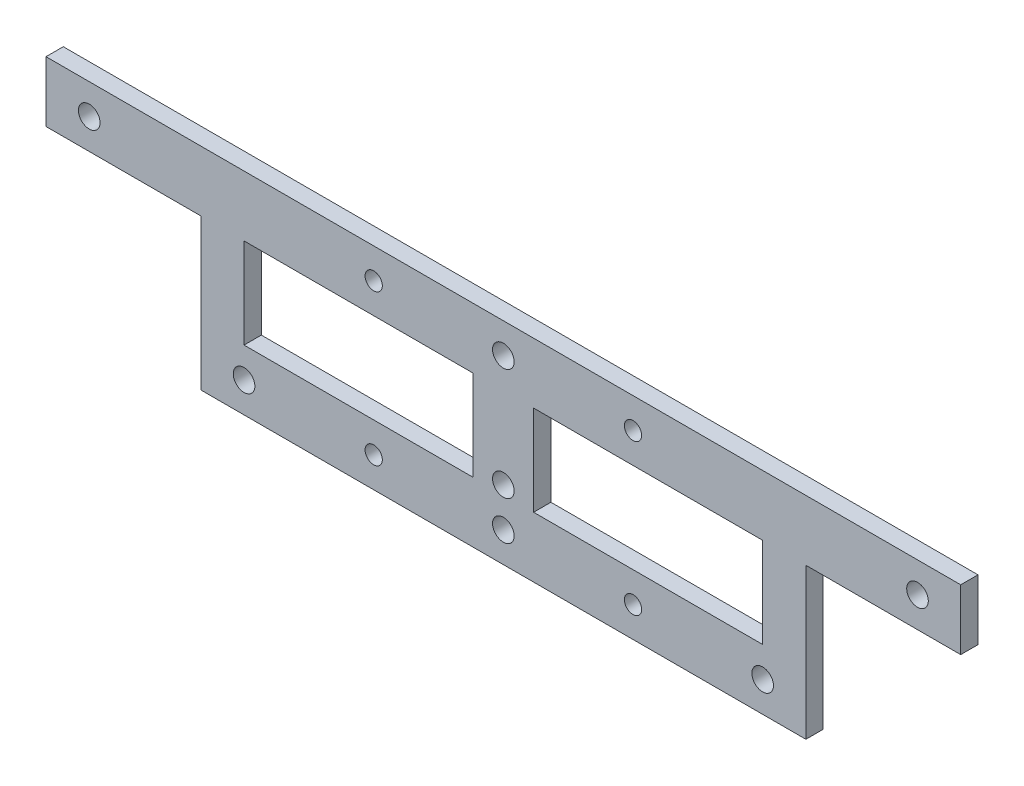
ISO-10303-21;
HEADER;
FILE_DESCRIPTION(('STEP AP214'),'2;1');
FILE_NAME('part.step','',(''),(''),'','','');
FILE_SCHEMA(('AUTOMOTIVE_DESIGN { 1 0 10303 214 1 1 1 1 }'));
ENDSEC;
DATA;
#1=APPLICATION_CONTEXT('core data for automotive mechanical design processes');
#2=APPLICATION_PROTOCOL_DEFINITION('international standard','automotive_design',2000,#1);
#3=PRODUCT_CONTEXT('',#1,'mechanical');
#4=PRODUCT('Part','Part','',(#3));
#5=PRODUCT_RELATED_PRODUCT_CATEGORY('part','',(#4));
#6=PRODUCT_DEFINITION_FORMATION('','',#4);
#7=PRODUCT_DEFINITION_CONTEXT('part definition',#1,'design');
#8=PRODUCT_DEFINITION('design','',#6,#7);
#9=PRODUCT_DEFINITION_SHAPE('','',#8);
#10=(LENGTH_UNIT() NAMED_UNIT(*) SI_UNIT(.MILLI.,.METRE.));
#11=(NAMED_UNIT(*) PLANE_ANGLE_UNIT() SI_UNIT($,.RADIAN.));
#12=(NAMED_UNIT(*) SI_UNIT($,.STERADIAN.) SOLID_ANGLE_UNIT());
#13=UNCERTAINTY_MEASURE_WITH_UNIT(LENGTH_MEASURE(1.E-05),#10,'distance_accuracy_value','');
#14=(GEOMETRIC_REPRESENTATION_CONTEXT(3) GLOBAL_UNCERTAINTY_ASSIGNED_CONTEXT((#13)) GLOBAL_UNIT_ASSIGNED_CONTEXT((#10,
#11,#12)) REPRESENTATION_CONTEXT('',''));
#15=CARTESIAN_POINT('',(0.,0.,0.));
#16=DIRECTION('',(0.,0.,1.));
#17=DIRECTION('',(1.,0.,0.));
#18=AXIS2_PLACEMENT_3D('',#15,#16,#17);
#19=CARTESIAN_POINT('',(0.,7.,4.));
#20=DIRECTION('',(0.,1.,0.));
#21=DIRECTION('',(0.,0.,1.));
#22=AXIS2_PLACEMENT_3D('',#19,#20,#21);
#23=PLANE('',#22);
#24=DIRECTION('',(1.,0.,0.));
#25=VECTOR('',#24,1.);
#26=CARTESIAN_POINT('',(0.,7.,0.));
#27=LINE('',#26,#25);
#28=CARTESIAN_POINT('',(7.,7.,0.));
#29=VERTEX_POINT('',#28);
#30=CARTESIAN_POINT('',(60.,7.,0.));
#31=VERTEX_POINT('',#30);
#32=EDGE_CURVE('E248',#29,#31,#27,.T.);
#33=ORIENTED_EDGE('',*,*,#32,.F.);
#34=DIRECTION('',(0.,0.,-1.));
#35=VECTOR('',#34,1.);
#36=CARTESIAN_POINT('',(7.,7.,4.));
#37=LINE('',#36,#35);
#38=CARTESIAN_POINT('',(7.,7.,4.));
#39=VERTEX_POINT('',#38);
#40=EDGE_CURVE('E11',#39,#29,#37,.T.);
#41=ORIENTED_EDGE('',*,*,#40,.F.);
#42=DIRECTION('',(1.,0.,0.));
#43=VECTOR('',#42,1.);
#44=CARTESIAN_POINT('',(0.,7.,4.));
#45=LINE('',#44,#43);
#46=CARTESIAN_POINT('',(60.,7.,4.));
#47=VERTEX_POINT('',#46);
#48=EDGE_CURVE('E170',#39,#47,#45,.T.);
#49=ORIENTED_EDGE('',*,*,#48,.T.);
#50=DIRECTION('',(0.,0.,-1.));
#51=VECTOR('',#50,1.);
#52=CARTESIAN_POINT('',(60.,7.,4.));
#53=LINE('',#52,#51);
#54=EDGE_CURVE('E54',#47,#31,#53,.T.);
#55=ORIENTED_EDGE('',*,*,#54,.T.);
#56=EDGE_LOOP('',(#33,#41,#49,#55));
#57=FACE_BOUND('',#56,.T.);
#58=ADVANCED_FACE('F35',(#57),#23,.T.);
#59=CARTESIAN_POINT('',(7.,0.,4.));
#60=DIRECTION('',(-1.,0.,0.));
#61=DIRECTION('',(0.,0.,1.));
#62=AXIS2_PLACEMENT_3D('',#59,#60,#61);
#63=PLANE('',#62);
#64=DIRECTION('',(0.,1.,0.));
#65=VECTOR('',#64,1.);
#66=CARTESIAN_POINT('',(7.,0.,0.));
#67=LINE('',#66,#65);
#68=CARTESIAN_POINT('',(7.,27.8779466073845,0.));
#69=VERTEX_POINT('',#68);
#70=EDGE_CURVE('E175',#29,#69,#67,.T.);
#71=ORIENTED_EDGE('',*,*,#70,.T.);
#72=DIRECTION('',(0.,0.,-1.));
#73=VECTOR('',#72,1.);
#74=CARTESIAN_POINT('',(7.,27.8779466073845,4.));
#75=LINE('',#74,#73);
#76=CARTESIAN_POINT('',(7.,27.8779466073845,4.));
#77=VERTEX_POINT('',#76);
#78=EDGE_CURVE('E45',#77,#69,#75,.T.);
#79=ORIENTED_EDGE('',*,*,#78,.F.);
#80=DIRECTION('',(0.,1.,0.));
#81=VECTOR('',#80,1.);
#82=CARTESIAN_POINT('',(7.,0.,4.));
#83=LINE('',#82,#81);
#84=EDGE_CURVE('E163',#39,#77,#83,.T.);
#85=ORIENTED_EDGE('',*,*,#84,.F.);
#86=ORIENTED_EDGE('',*,*,#40,.T.);
#87=EDGE_LOOP('',(#71,#79,#85,#86));
#88=FACE_BOUND('',#87,.T.);
#89=ADVANCED_FACE('F173',(#88),#63,.F.);
#90=CARTESIAN_POINT('',(0.,27.8779466073845,4.));
#91=DIRECTION('',(0.,1.,0.));
#92=DIRECTION('',(0.,0.,1.));
#93=AXIS2_PLACEMENT_3D('',#90,#91,#92);
#94=PLANE('',#93);
#95=DIRECTION('',(1.,0.,0.));
#96=VECTOR('',#95,1.);
#97=CARTESIAN_POINT('',(0.,27.8779466073845,0.));
#98=LINE('',#97,#96);
#99=CARTESIAN_POINT('',(60.,27.8779466073845,0.));
#100=VERTEX_POINT('',#99);
#101=EDGE_CURVE('E222',#69,#100,#98,.T.);
#102=ORIENTED_EDGE('',*,*,#101,.T.);
#103=DIRECTION('',(0.,0.,-1.));
#104=VECTOR('',#103,1.);
#105=CARTESIAN_POINT('',(60.,27.8779466073845,4.));
#106=LINE('',#105,#104);
#107=CARTESIAN_POINT('',(60.,27.8779466073845,4.));
#108=VERTEX_POINT('',#107);
#109=EDGE_CURVE('E104',#108,#100,#106,.T.);
#110=ORIENTED_EDGE('',*,*,#109,.F.);
#111=DIRECTION('',(1.,0.,0.));
#112=VECTOR('',#111,1.);
#113=CARTESIAN_POINT('',(0.,27.8779466073845,4.));
#114=LINE('',#113,#112);
#115=EDGE_CURVE('E155',#77,#108,#114,.T.);
#116=ORIENTED_EDGE('',*,*,#115,.F.);
#117=ORIENTED_EDGE('',*,*,#78,.T.);
#118=EDGE_LOOP('',(#102,#110,#116,#117));
#119=FACE_BOUND('',#118,.T.);
#120=ADVANCED_FACE('F157',(#119),#94,.F.);
#121=CARTESIAN_POINT('',(-60.,7.,0.));
#122=VERTEX_POINT('',#121);
#123=CARTESIAN_POINT('',(-7.,7.,0.));
#124=VERTEX_POINT('',#123);
#125=EDGE_CURVE('E244',#122,#124,#27,.T.);
#126=ORIENTED_EDGE('',*,*,#125,.F.);
#127=DIRECTION('',(0.,0.,-1.));
#128=VECTOR('',#127,1.);
#129=CARTESIAN_POINT('',(-60.,7.,4.));
#130=LINE('',#129,#128);
#131=CARTESIAN_POINT('',(-60.,7.,4.));
#132=VERTEX_POINT('',#131);
#133=EDGE_CURVE('E187',#132,#122,#130,.T.);
#134=ORIENTED_EDGE('',*,*,#133,.F.);
#135=CARTESIAN_POINT('',(-7.,7.,4.));
#136=VERTEX_POINT('',#135);
#137=EDGE_CURVE('E311',#132,#136,#45,.T.);
#138=ORIENTED_EDGE('',*,*,#137,.T.);
#139=DIRECTION('',(0.,0.,-1.));
#140=VECTOR('',#139,1.);
#141=CARTESIAN_POINT('',(-7.,7.,4.));
#142=LINE('',#141,#140);
#143=EDGE_CURVE('E180',#136,#124,#142,.T.);
#144=ORIENTED_EDGE('',*,*,#143,.T.);
#145=EDGE_LOOP('',(#126,#134,#138,#144));
#146=FACE_BOUND('',#145,.T.);
#147=ADVANCED_FACE('F370',(#146),#23,.T.);
#148=CARTESIAN_POINT('',(-60.,0.,4.));
#149=DIRECTION('',(-1.,0.,0.));
#150=DIRECTION('',(0.,0.,1.));
#151=AXIS2_PLACEMENT_3D('',#148,#149,#150);
#152=PLANE('',#151);
#153=DIRECTION('',(0.,1.,0.));
#154=VECTOR('',#153,1.);
#155=CARTESIAN_POINT('',(-60.,0.,0.));
#156=LINE('',#155,#154);
#157=CARTESIAN_POINT('',(-60.,27.8779466073845,0.));
#158=VERTEX_POINT('',#157);
#159=EDGE_CURVE('E247',#122,#158,#156,.T.);
#160=ORIENTED_EDGE('',*,*,#159,.T.);
#161=DIRECTION('',(0.,0.,-1.));
#162=VECTOR('',#161,1.);
#163=CARTESIAN_POINT('',(-60.,27.8779466073845,4.));
#164=LINE('',#163,#162);
#165=CARTESIAN_POINT('',(-60.,27.8779466073845,4.));
#166=VERTEX_POINT('',#165);
#167=EDGE_CURVE('E184',#166,#158,#164,.T.);
#168=ORIENTED_EDGE('',*,*,#167,.F.);
#169=DIRECTION('',(0.,1.,0.));
#170=VECTOR('',#169,1.);
#171=CARTESIAN_POINT('',(-60.,0.,4.));
#172=LINE('',#171,#170);
#173=EDGE_CURVE('E314',#132,#166,#172,.T.);
#174=ORIENTED_EDGE('',*,*,#173,.F.);
#175=ORIENTED_EDGE('',*,*,#133,.T.);
#176=EDGE_LOOP('',(#160,#168,#174,#175));
#177=FACE_BOUND('',#176,.T.);
#178=ADVANCED_FACE('F377',(#177),#152,.F.);
#179=CARTESIAN_POINT('',(0.,27.8779466073845,4.));
#180=DIRECTION('',(0.,1.,0.));
#181=DIRECTION('',(0.,0.,1.));
#182=AXIS2_PLACEMENT_3D('',#179,#180,#181);
#183=PLANE('',#182);
#184=DIRECTION('',(1.,0.,0.));
#185=VECTOR('',#184,1.);
#186=CARTESIAN_POINT('',(0.,27.8779466073845,0.));
#187=LINE('',#186,#185);
#188=CARTESIAN_POINT('',(-7.,27.8779466073845,0.));
#189=VERTEX_POINT('',#188);
#190=EDGE_CURVE('E239',#158,#189,#187,.T.);
#191=ORIENTED_EDGE('',*,*,#190,.T.);
#192=DIRECTION('',(0.,0.,-1.));
#193=VECTOR('',#192,1.);
#194=CARTESIAN_POINT('',(-7.,27.8779466073845,4.));
#195=LINE('',#194,#193);
#196=CARTESIAN_POINT('',(-7.,27.8779466073845,4.));
#197=VERTEX_POINT('',#196);
#198=EDGE_CURVE('E182',#197,#189,#195,.T.);
#199=ORIENTED_EDGE('',*,*,#198,.F.);
#200=DIRECTION('',(1.,0.,0.));
#201=VECTOR('',#200,1.);
#202=CARTESIAN_POINT('',(0.,27.8779466073845,4.));
#203=LINE('',#202,#201);
#204=EDGE_CURVE('E306',#166,#197,#203,.T.);
#205=ORIENTED_EDGE('',*,*,#204,.F.);
#206=ORIENTED_EDGE('',*,*,#167,.T.);
#207=EDGE_LOOP('',(#191,#199,#205,#206));
#208=FACE_BOUND('',#207,.T.);
#209=ADVANCED_FACE('F383',(#208),#183,.F.);
#210=CARTESIAN_POINT('',(70.,0.,4.));
#211=DIRECTION('',(1.,0.,0.));
#212=DIRECTION('',(0.,0.,-1.));
#213=AXIS2_PLACEMENT_3D('',#210,#211,#212);
#214=PLANE('',#213);
#215=DIRECTION('',(0.,-1.,0.));
#216=VECTOR('',#215,1.);
#217=CARTESIAN_POINT('',(70.,0.,0.));
#218=LINE('',#217,#216);
#219=CARTESIAN_POINT('',(70.,27.8779466073845,0.));
#220=VERTEX_POINT('',#219);
#221=CARTESIAN_POINT('',(70.,-7.,0.));
#222=VERTEX_POINT('',#221);
#223=EDGE_CURVE('E218',#220,#222,#218,.T.);
#224=ORIENTED_EDGE('',*,*,#223,.F.);
#225=DIRECTION('',(0.,0.,-1.));
#226=VECTOR('',#225,1.);
#227=CARTESIAN_POINT('',(70.,27.8779466073845,4.));
#228=LINE('',#227,#226);
#229=CARTESIAN_POINT('',(70.,27.8779466073845,4.));
#230=VERTEX_POINT('',#229);
#231=EDGE_CURVE('E39',#230,#220,#228,.T.);
#232=ORIENTED_EDGE('',*,*,#231,.F.);
#233=DIRECTION('',(0.,-1.,0.));
#234=VECTOR('',#233,1.);
#235=CARTESIAN_POINT('',(70.,0.,4.));
#236=LINE('',#235,#234);
#237=CARTESIAN_POINT('',(70.,-7.,4.));
#238=VERTEX_POINT('',#237);
#239=EDGE_CURVE('E290',#230,#238,#236,.T.);
#240=ORIENTED_EDGE('',*,*,#239,.T.);
#241=DIRECTION('',(0.,0.,-1.));
#242=VECTOR('',#241,1.);
#243=CARTESIAN_POINT('',(70.,-7.,4.));
#244=LINE('',#243,#242);
#245=EDGE_CURVE('E189',#238,#222,#244,.T.);
#246=ORIENTED_EDGE('',*,*,#245,.T.);
#247=EDGE_LOOP('',(#224,#232,#240,#246));
#248=FACE_BOUND('',#247,.T.);
#249=ADVANCED_FACE('F37',(#248),#214,.T.);
#250=CARTESIAN_POINT('',(105.826370740733,27.8779466073845,0.));
#251=VERTEX_POINT('',#250);
#252=EDGE_CURVE('E210',#220,#251,#98,.T.);
#253=ORIENTED_EDGE('',*,*,#252,.T.);
#254=DIRECTION('',(0.,0.,-1.));
#255=VECTOR('',#254,1.);
#256=CARTESIAN_POINT('',(105.826370740733,27.8779466073845,4.));
#257=LINE('',#256,#255);
#258=CARTESIAN_POINT('',(105.826370740733,27.8779466073845,4.));
#259=VERTEX_POINT('',#258);
#260=EDGE_CURVE('E201',#259,#251,#257,.T.);
#261=ORIENTED_EDGE('',*,*,#260,.F.);
#262=EDGE_CURVE('E165',#230,#259,#114,.T.);
#263=ORIENTED_EDGE('',*,*,#262,.F.);
#264=ORIENTED_EDGE('',*,*,#231,.T.);
#265=EDGE_LOOP('',(#253,#261,#263,#264));
#266=FACE_BOUND('',#265,.T.);
#267=ADVANCED_FACE('F209',(#266),#94,.F.);
#268=CARTESIAN_POINT('',(105.826370740733,0.,4.));
#269=DIRECTION('',(1.,0.,0.));
#270=DIRECTION('',(0.,0.,-1.));
#271=AXIS2_PLACEMENT_3D('',#268,#269,#270);
#272=PLANE('',#271);
#273=DIRECTION('',(0.,-1.,0.));
#274=VECTOR('',#273,1.);
#275=CARTESIAN_POINT('',(105.826370740733,0.,0.));
#276=LINE('',#275,#274);
#277=CARTESIAN_POINT('',(105.826370740733,41.8779466073845,0.));
#278=VERTEX_POINT('',#277);
#279=EDGE_CURVE('E220',#278,#251,#276,.T.);
#280=ORIENTED_EDGE('',*,*,#279,.F.);
#281=DIRECTION('',(0.,0.,-1.));
#282=VECTOR('',#281,1.);
#283=CARTESIAN_POINT('',(105.826370740733,41.8779466073845,4.));
#284=LINE('',#283,#282);
#285=CARTESIAN_POINT('',(105.826370740733,41.8779466073845,4.));
#286=VERTEX_POINT('',#285);
#287=EDGE_CURVE('E200',#286,#278,#284,.T.);
#288=ORIENTED_EDGE('',*,*,#287,.F.);
#289=DIRECTION('',(0.,-1.,0.));
#290=VECTOR('',#289,1.);
#291=CARTESIAN_POINT('',(105.826370740733,0.,4.));
#292=LINE('',#291,#290);
#293=EDGE_CURVE('E294',#286,#259,#292,.T.);
#294=ORIENTED_EDGE('',*,*,#293,.T.);
#295=ORIENTED_EDGE('',*,*,#260,.T.);
#296=EDGE_LOOP('',(#280,#288,#294,#295));
#297=FACE_BOUND('',#296,.T.);
#298=ADVANCED_FACE('F432',(#297),#272,.T.);
#299=CARTESIAN_POINT('',(0.,41.8779466073845,4.));
#300=DIRECTION('',(0.,1.,0.));
#301=DIRECTION('',(0.,0.,1.));
#302=AXIS2_PLACEMENT_3D('',#299,#300,#301);
#303=PLANE('',#302);
#304=DIRECTION('',(1.,0.,0.));
#305=VECTOR('',#304,1.);
#306=CARTESIAN_POINT('',(0.,41.8779466073845,0.));
#307=LINE('',#306,#305);
#308=CARTESIAN_POINT('',(-105.826370740733,41.8779466073845,0.));
#309=VERTEX_POINT('',#308);
#310=EDGE_CURVE('E230',#309,#278,#307,.T.);
#311=ORIENTED_EDGE('',*,*,#310,.F.);
#312=DIRECTION('',(0.,0.,-1.));
#313=VECTOR('',#312,1.);
#314=CARTESIAN_POINT('',(-105.826370740733,41.8779466073845,4.));
#315=LINE('',#314,#313);
#316=CARTESIAN_POINT('',(-105.826370740733,41.8779466073845,4.));
#317=VERTEX_POINT('',#316);
#318=EDGE_CURVE('E198',#317,#309,#315,.T.);
#319=ORIENTED_EDGE('',*,*,#318,.F.);
#320=DIRECTION('',(1.,0.,0.));
#321=VECTOR('',#320,1.);
#322=CARTESIAN_POINT('',(0.,41.8779466073845,4.));
#323=LINE('',#322,#321);
#324=EDGE_CURVE('E297',#317,#286,#323,.T.);
#325=ORIENTED_EDGE('',*,*,#324,.T.);
#326=ORIENTED_EDGE('',*,*,#287,.T.);
#327=EDGE_LOOP('',(#311,#319,#325,#326));
#328=FACE_BOUND('',#327,.T.);
#329=ADVANCED_FACE('F417',(#328),#303,.T.);
#330=CARTESIAN_POINT('',(-105.826370740733,0.,4.));
#331=DIRECTION('',(-1.,0.,0.));
#332=DIRECTION('',(0.,0.,1.));
#333=AXIS2_PLACEMENT_3D('',#330,#331,#332);
#334=PLANE('',#333);
#335=DIRECTION('',(0.,1.,0.));
#336=VECTOR('',#335,1.);
#337=CARTESIAN_POINT('',(-105.826370740733,0.,0.));
#338=LINE('',#337,#336);
#339=CARTESIAN_POINT('',(-105.826370740733,27.8779466073845,0.));
#340=VERTEX_POINT('',#339);
#341=EDGE_CURVE('E232',#340,#309,#338,.T.);
#342=ORIENTED_EDGE('',*,*,#341,.F.);
#343=DIRECTION('',(0.,0.,-1.));
#344=VECTOR('',#343,1.);
#345=CARTESIAN_POINT('',(-105.826370740733,27.8779466073845,4.));
#346=LINE('',#345,#344);
#347=CARTESIAN_POINT('',(-105.826370740733,27.8779466073845,4.));
#348=VERTEX_POINT('',#347);
#349=EDGE_CURVE('E196',#348,#340,#346,.T.);
#350=ORIENTED_EDGE('',*,*,#349,.F.);
#351=DIRECTION('',(0.,1.,0.));
#352=VECTOR('',#351,1.);
#353=CARTESIAN_POINT('',(-105.826370740733,0.,4.));
#354=LINE('',#353,#352);
#355=EDGE_CURVE('E300',#348,#317,#354,.T.);
#356=ORIENTED_EDGE('',*,*,#355,.T.);
#357=ORIENTED_EDGE('',*,*,#318,.T.);
#358=EDGE_LOOP('',(#342,#350,#356,#357));
#359=FACE_BOUND('',#358,.T.);
#360=ADVANCED_FACE('F408',(#359),#334,.T.);
#361=CARTESIAN_POINT('',(-70.,27.8779466073845,0.));
#362=VERTEX_POINT('',#361);
#363=EDGE_CURVE('E235',#340,#362,#187,.T.);
#364=ORIENTED_EDGE('',*,*,#363,.T.);
#365=DIRECTION('',(0.,0.,-1.));
#366=VECTOR('',#365,1.);
#367=CARTESIAN_POINT('',(-70.,27.8779466073845,4.));
#368=LINE('',#367,#366);
#369=CARTESIAN_POINT('',(-70.,27.8779466073845,4.));
#370=VERTEX_POINT('',#369);
#371=EDGE_CURVE('E194',#370,#362,#368,.T.);
#372=ORIENTED_EDGE('',*,*,#371,.F.);
#373=EDGE_CURVE('E303',#348,#370,#203,.T.);
#374=ORIENTED_EDGE('',*,*,#373,.F.);
#375=ORIENTED_EDGE('',*,*,#349,.T.);
#376=EDGE_LOOP('',(#364,#372,#374,#375));
#377=FACE_BOUND('',#376,.T.);
#378=ADVANCED_FACE('F402',(#377),#183,.F.);
#379=CARTESIAN_POINT('',(-70.,0.,4.));
#380=DIRECTION('',(-1.,0.,0.));
#381=DIRECTION('',(0.,0.,1.));
#382=AXIS2_PLACEMENT_3D('',#379,#380,#381);
#383=PLANE('',#382);
#384=DIRECTION('',(0.,1.,0.));
#385=VECTOR('',#384,1.);
#386=CARTESIAN_POINT('',(-70.,0.,0.));
#387=LINE('',#386,#385);
#388=CARTESIAN_POINT('',(-70.,-7.,0.));
#389=VERTEX_POINT('',#388);
#390=EDGE_CURVE('E238',#389,#362,#387,.T.);
#391=ORIENTED_EDGE('',*,*,#390,.F.);
#392=DIRECTION('',(0.,0.,-1.));
#393=VECTOR('',#392,1.);
#394=CARTESIAN_POINT('',(-70.,-7.,4.));
#395=LINE('',#394,#393);
#396=CARTESIAN_POINT('',(-70.,-7.,4.));
#397=VERTEX_POINT('',#396);
#398=EDGE_CURVE('E191',#397,#389,#395,.T.);
#399=ORIENTED_EDGE('',*,*,#398,.F.);
#400=DIRECTION('',(0.,1.,0.));
#401=VECTOR('',#400,1.);
#402=CARTESIAN_POINT('',(-70.,0.,4.));
#403=LINE('',#402,#401);
#404=EDGE_CURVE('E305',#397,#370,#403,.T.);
#405=ORIENTED_EDGE('',*,*,#404,.T.);
#406=ORIENTED_EDGE('',*,*,#371,.T.);
#407=EDGE_LOOP('',(#391,#399,#405,#406));
#408=FACE_BOUND('',#407,.T.);
#409=ADVANCED_FACE('F407',(#408),#383,.T.);
#410=CARTESIAN_POINT('',(30.,34.8779466073845,4.));
#411=DIRECTION('',(0.,0.,-1.));
#412=DIRECTION('',(-1.,0.,0.));
#413=AXIS2_PLACEMENT_3D('',#410,#411,#412);
#414=CYLINDRICAL_SURFACE('',#413,2.);
#415=CARTESIAN_POINT('',(30.,34.8779466073845,4.));
#416=DIRECTION('',(0.,0.,1.));
#417=DIRECTION('',(1.,0.,0.));
#418=AXIS2_PLACEMENT_3D('',#415,#416,#417);
#419=CIRCLE('',#418,2.);
#420=CARTESIAN_POINT('',(32.,34.8779466073845,4.));
#421=VERTEX_POINT('',#420);
#422=EDGE_CURVE('E347',#421,#421,#419,.T.);
#423=ORIENTED_EDGE('',*,*,#422,.T.);
#424=EDGE_LOOP('',(#423));
#425=FACE_BOUND('',#424,.T.);
#426=CARTESIAN_POINT('',(30.,34.8779466073845,0.));
#427=DIRECTION('',(0.,0.,1.));
#428=DIRECTION('',(1.,0.,0.));
#429=AXIS2_PLACEMENT_3D('',#426,#427,#428);
#430=CIRCLE('',#429,2.);
#431=CARTESIAN_POINT('',(32.,34.8779466073845,0.));
#432=VERTEX_POINT('',#431);
#433=EDGE_CURVE('E285',#432,#432,#430,.T.);
#434=ORIENTED_EDGE('',*,*,#433,.F.);
#435=EDGE_LOOP('',(#434));
#436=FACE_BOUND('',#435,.T.);
#437=ADVANCED_FACE('F414',(#425,#436),#414,.F.);
#438=CARTESIAN_POINT('',(60.,0.,4.));
#439=DIRECTION('',(0.,0.,-1.));
#440=DIRECTION('',(-1.,0.,0.));
#441=AXIS2_PLACEMENT_3D('',#438,#439,#440);
#442=CYLINDRICAL_SURFACE('',#441,2.5);
#443=CARTESIAN_POINT('',(60.,0.,4.));
#444=DIRECTION('',(0.,0.,1.));
#445=DIRECTION('',(1.,0.,0.));
#446=AXIS2_PLACEMENT_3D('',#443,#444,#445);
#447=CIRCLE('',#446,2.5);
#448=CARTESIAN_POINT('',(62.5,0.,4.));
#449=VERTEX_POINT('',#448);
#450=EDGE_CURVE('E345',#449,#449,#447,.T.);
#451=ORIENTED_EDGE('',*,*,#450,.T.);
#452=EDGE_LOOP('',(#451));
#453=FACE_BOUND('',#452,.T.);
#454=CARTESIAN_POINT('',(60.,0.,0.));
#455=DIRECTION('',(0.,0.,1.));
#456=DIRECTION('',(1.,0.,0.));
#457=AXIS2_PLACEMENT_3D('',#454,#455,#456);
#458=CIRCLE('',#457,2.5);
#459=CARTESIAN_POINT('',(62.5,0.,0.));
#460=VERTEX_POINT('',#459);
#461=EDGE_CURVE('E282',#460,#460,#458,.T.);
#462=ORIENTED_EDGE('',*,*,#461,.F.);
#463=EDGE_LOOP('',(#462));
#464=FACE_BOUND('',#463,.T.);
#465=ADVANCED_FACE('F484',(#453,#464),#442,.F.);
#466=CARTESIAN_POINT('',(0.,0.,4.));
#467=DIRECTION('',(0.,0.,-1.));
#468=DIRECTION('',(-1.,0.,0.));
#469=AXIS2_PLACEMENT_3D('',#466,#467,#468);
#470=CYLINDRICAL_SURFACE('',#469,2.5);
#471=CARTESIAN_POINT('',(0.,0.,4.));
#472=DIRECTION('',(0.,0.,1.));
#473=DIRECTION('',(1.,0.,0.));
#474=AXIS2_PLACEMENT_3D('',#471,#472,#473);
#475=CIRCLE('',#474,2.5);
#476=CARTESIAN_POINT('',(2.5,0.,4.));
#477=VERTEX_POINT('',#476);
#478=EDGE_CURVE('E342',#477,#477,#475,.T.);
#479=ORIENTED_EDGE('',*,*,#478,.T.);
#480=EDGE_LOOP('',(#479));
#481=FACE_BOUND('',#480,.T.);
#482=CARTESIAN_POINT('',(0.,0.,0.));
#483=DIRECTION('',(0.,0.,1.));
#484=DIRECTION('',(1.,0.,0.));
#485=AXIS2_PLACEMENT_3D('',#482,#483,#484);
#486=CIRCLE('',#485,2.5);
#487=CARTESIAN_POINT('',(2.5,0.,0.));
#488=VERTEX_POINT('',#487);
#489=EDGE_CURVE('E279',#488,#488,#486,.T.);
#490=ORIENTED_EDGE('',*,*,#489,.F.);
#491=EDGE_LOOP('',(#490));
#492=FACE_BOUND('',#491,.T.);
#493=ADVANCED_FACE('F480',(#481,#492),#470,.F.);
#494=CARTESIAN_POINT('',(-60.,0.,4.));
#495=DIRECTION('',(0.,0.,-1.));
#496=DIRECTION('',(-1.,0.,0.));
#497=AXIS2_PLACEMENT_3D('',#494,#495,#496);
#498=CYLINDRICAL_SURFACE('',#497,2.5);
#499=CARTESIAN_POINT('',(-60.,0.,4.));
#500=DIRECTION('',(0.,0.,1.));
#501=DIRECTION('',(1.,0.,0.));
#502=AXIS2_PLACEMENT_3D('',#499,#500,#501);
#503=CIRCLE('',#502,2.5);
#504=CARTESIAN_POINT('',(-57.5,0.,4.));
#505=VERTEX_POINT('',#504);
#506=EDGE_CURVE('E339',#505,#505,#503,.T.);
#507=ORIENTED_EDGE('',*,*,#506,.T.);
#508=EDGE_LOOP('',(#507));
#509=FACE_BOUND('',#508,.T.);
#510=CARTESIAN_POINT('',(-60.,0.,0.));
#511=DIRECTION('',(0.,0.,1.));
#512=DIRECTION('',(1.,0.,0.));
#513=AXIS2_PLACEMENT_3D('',#510,#511,#512);
#514=CIRCLE('',#513,2.5);
#515=CARTESIAN_POINT('',(-57.5,0.,0.));
#516=VERTEX_POINT('',#515);
#517=EDGE_CURVE('E276',#516,#516,#514,.T.);
#518=ORIENTED_EDGE('',*,*,#517,.F.);
#519=EDGE_LOOP('',(#518));
#520=FACE_BOUND('',#519,.T.);
#521=ADVANCED_FACE('F476',(#509,#520),#498,.F.);
#522=CARTESIAN_POINT('',(-30.,0.,4.));
#523=DIRECTION('',(0.,0.,-1.));
#524=DIRECTION('',(-1.,0.,0.));
#525=AXIS2_PLACEMENT_3D('',#522,#523,#524);
#526=CYLINDRICAL_SURFACE('',#525,2.);
#527=CARTESIAN_POINT('',(-30.,0.,4.));
#528=DIRECTION('',(0.,0.,1.));
#529=DIRECTION('',(1.,0.,0.));
#530=AXIS2_PLACEMENT_3D('',#527,#528,#529);
#531=CIRCLE('',#530,2.);
#532=CARTESIAN_POINT('',(-28.,0.,4.));
#533=VERTEX_POINT('',#532);
#534=EDGE_CURVE('E336',#533,#533,#531,.T.);
#535=ORIENTED_EDGE('',*,*,#534,.T.);
#536=EDGE_LOOP('',(#535));
#537=FACE_BOUND('',#536,.T.);
#538=CARTESIAN_POINT('',(-30.,0.,0.));
#539=DIRECTION('',(0.,0.,1.));
#540=DIRECTION('',(1.,0.,0.));
#541=AXIS2_PLACEMENT_3D('',#538,#539,#540);
#542=CIRCLE('',#541,2.);
#543=CARTESIAN_POINT('',(-28.,0.,0.));
#544=VERTEX_POINT('',#543);
#545=EDGE_CURVE('E273',#544,#544,#542,.T.);
#546=ORIENTED_EDGE('',*,*,#545,.F.);
#547=EDGE_LOOP('',(#546));
#548=FACE_BOUND('',#547,.T.);
#549=ADVANCED_FACE('F472',(#537,#548),#526,.F.);
#550=CARTESIAN_POINT('',(30.,0.,4.));
#551=DIRECTION('',(0.,0.,-1.));
#552=DIRECTION('',(-1.,0.,0.));
#553=AXIS2_PLACEMENT_3D('',#550,#551,#552);
#554=CYLINDRICAL_SURFACE('',#553,2.);
#555=CARTESIAN_POINT('',(30.,0.,4.));
#556=DIRECTION('',(0.,0.,1.));
#557=DIRECTION('',(1.,0.,0.));
#558=AXIS2_PLACEMENT_3D('',#555,#556,#557);
#559=CIRCLE('',#558,2.);
#560=CARTESIAN_POINT('',(32.,0.,4.));
#561=VERTEX_POINT('',#560);
#562=EDGE_CURVE('E333',#561,#561,#559,.T.);
#563=ORIENTED_EDGE('',*,*,#562,.T.);
#564=EDGE_LOOP('',(#563));
#565=FACE_BOUND('',#564,.T.);
#566=CARTESIAN_POINT('',(30.,0.,0.));
#567=DIRECTION('',(0.,0.,1.));
#568=DIRECTION('',(1.,0.,0.));
#569=AXIS2_PLACEMENT_3D('',#566,#567,#568);
#570=CIRCLE('',#569,2.);
#571=CARTESIAN_POINT('',(32.,0.,0.));
#572=VERTEX_POINT('',#571);
#573=EDGE_CURVE('E270',#572,#572,#570,.T.);
#574=ORIENTED_EDGE('',*,*,#573,.F.);
#575=EDGE_LOOP('',(#574));
#576=FACE_BOUND('',#575,.T.);
#577=ADVANCED_FACE('F468',(#565,#576),#554,.F.);
#578=CARTESIAN_POINT('',(0.,34.8779466073845,4.));
#579=DIRECTION('',(0.,0.,-1.));
#580=DIRECTION('',(-1.,0.,0.));
#581=AXIS2_PLACEMENT_3D('',#578,#579,#580);
#582=CYLINDRICAL_SURFACE('',#581,2.5);
#583=CARTESIAN_POINT('',(0.,34.8779466073845,4.));
#584=DIRECTION('',(0.,0.,1.));
#585=DIRECTION('',(1.,0.,0.));
#586=AXIS2_PLACEMENT_3D('',#583,#584,#585);
#587=CIRCLE('',#586,2.5);
#588=CARTESIAN_POINT('',(2.5,34.8779466073845,4.));
#589=VERTEX_POINT('',#588);
#590=EDGE_CURVE('E330',#589,#589,#587,.T.);
#591=ORIENTED_EDGE('',*,*,#590,.T.);
#592=EDGE_LOOP('',(#591));
#593=FACE_BOUND('',#592,.T.);
#594=CARTESIAN_POINT('',(0.,34.8779466073845,0.));
#595=DIRECTION('',(0.,0.,1.));
#596=DIRECTION('',(1.,0.,0.));
#597=AXIS2_PLACEMENT_3D('',#594,#595,#596);
#598=CIRCLE('',#597,2.5);
#599=CARTESIAN_POINT('',(2.5,34.8779466073845,0.));
#600=VERTEX_POINT('',#599);
#601=EDGE_CURVE('E267',#600,#600,#598,.T.);
#602=ORIENTED_EDGE('',*,*,#601,.F.);
#603=EDGE_LOOP('',(#602));
#604=FACE_BOUND('',#603,.T.);
#605=ADVANCED_FACE('F464',(#593,#604),#582,.F.);
#606=CARTESIAN_POINT('',(0.,9.,4.));
#607=DIRECTION('',(0.,0.,-1.));
#608=DIRECTION('',(-1.,0.,0.));
#609=AXIS2_PLACEMENT_3D('',#606,#607,#608);
#610=CYLINDRICAL_SURFACE('',#609,2.5);
#611=CARTESIAN_POINT('',(0.,9.,4.));
#612=DIRECTION('',(0.,0.,1.));
#613=DIRECTION('',(1.,0.,0.));
#614=AXIS2_PLACEMENT_3D('',#611,#612,#613);
#615=CIRCLE('',#614,2.5);
#616=CARTESIAN_POINT('',(2.5,9.,4.));
#617=VERTEX_POINT('',#616);
#618=EDGE_CURVE('E327',#617,#617,#615,.T.);
#619=ORIENTED_EDGE('',*,*,#618,.T.);
#620=EDGE_LOOP('',(#619));
#621=FACE_BOUND('',#620,.T.);
#622=CARTESIAN_POINT('',(0.,9.,0.));
#623=DIRECTION('',(0.,0.,1.));
#624=DIRECTION('',(1.,0.,0.));
#625=AXIS2_PLACEMENT_3D('',#622,#623,#624);
#626=CIRCLE('',#625,2.5);
#627=CARTESIAN_POINT('',(2.5,9.,0.));
#628=VERTEX_POINT('',#627);
#629=EDGE_CURVE('E264',#628,#628,#626,.T.);
#630=ORIENTED_EDGE('',*,*,#629,.F.);
#631=EDGE_LOOP('',(#630));
#632=FACE_BOUND('',#631,.T.);
#633=ADVANCED_FACE('F460',(#621,#632),#610,.F.);
#634=CARTESIAN_POINT('',(-95.8263707407328,34.8779466073845,4.));
#635=DIRECTION('',(0.,0.,-1.));
#636=DIRECTION('',(-1.,0.,0.));
#637=AXIS2_PLACEMENT_3D('',#634,#635,#636);
#638=CYLINDRICAL_SURFACE('',#637,2.50000000000001);
#639=CARTESIAN_POINT('',(-95.8263707407328,34.8779466073845,4.));
#640=DIRECTION('',(0.,0.,1.));
#641=DIRECTION('',(1.,0.,0.));
#642=AXIS2_PLACEMENT_3D('',#639,#640,#641);
#643=CIRCLE('',#642,2.50000000000001);
#644=CARTESIAN_POINT('',(-93.3263707407328,34.8779466073845,4.));
#645=VERTEX_POINT('',#644);
#646=EDGE_CURVE('E324',#645,#645,#643,.T.);
#647=ORIENTED_EDGE('',*,*,#646,.T.);
#648=EDGE_LOOP('',(#647));
#649=FACE_BOUND('',#648,.T.);
#650=CARTESIAN_POINT('',(-95.8263707407328,34.8779466073845,0.));
#651=DIRECTION('',(0.,0.,1.));
#652=DIRECTION('',(1.,0.,0.));
#653=AXIS2_PLACEMENT_3D('',#650,#651,#652);
#654=CIRCLE('',#653,2.50000000000001);
#655=CARTESIAN_POINT('',(-93.3263707407328,34.8779466073845,0.));
#656=VERTEX_POINT('',#655);
#657=EDGE_CURVE('E261',#656,#656,#654,.T.);
#658=ORIENTED_EDGE('',*,*,#657,.F.);
#659=EDGE_LOOP('',(#658));
#660=FACE_BOUND('',#659,.T.);
#661=ADVANCED_FACE('F454',(#649,#660),#638,.F.);
#662=CARTESIAN_POINT('',(-30.,34.8779466073845,4.));
#663=DIRECTION('',(0.,0.,-1.));
#664=DIRECTION('',(-1.,0.,0.));
#665=AXIS2_PLACEMENT_3D('',#662,#663,#664);
#666=CYLINDRICAL_SURFACE('',#665,2.);
#667=CARTESIAN_POINT('',(-30.,34.8779466073845,4.));
#668=DIRECTION('',(0.,0.,1.));
#669=DIRECTION('',(1.,0.,0.));
#670=AXIS2_PLACEMENT_3D('',#667,#668,#669);
#671=CIRCLE('',#670,2.);
#672=CARTESIAN_POINT('',(-28.,34.8779466073845,4.));
#673=VERTEX_POINT('',#672);
#674=EDGE_CURVE('E321',#673,#673,#671,.T.);
#675=ORIENTED_EDGE('',*,*,#674,.T.);
#676=EDGE_LOOP('',(#675));
#677=FACE_BOUND('',#676,.T.);
#678=CARTESIAN_POINT('',(-30.,34.8779466073845,0.));
#679=DIRECTION('',(0.,0.,1.));
#680=DIRECTION('',(1.,0.,0.));
#681=AXIS2_PLACEMENT_3D('',#678,#679,#680);
#682=CIRCLE('',#681,2.);
#683=CARTESIAN_POINT('',(-28.,34.8779466073845,0.));
#684=VERTEX_POINT('',#683);
#685=EDGE_CURVE('E258',#684,#684,#682,.T.);
#686=ORIENTED_EDGE('',*,*,#685,.F.);
#687=EDGE_LOOP('',(#686));
#688=FACE_BOUND('',#687,.T.);
#689=ADVANCED_FACE('F449',(#677,#688),#666,.F.);
#690=CARTESIAN_POINT('',(60.,0.,4.));
#691=DIRECTION('',(-1.,0.,0.));
#692=DIRECTION('',(0.,0.,1.));
#693=AXIS2_PLACEMENT_3D('',#690,#691,#692);
#694=PLANE('',#693);
#695=DIRECTION('',(0.,1.,0.));
#696=VECTOR('',#695,1.);
#697=CARTESIAN_POINT('',(60.,0.,0.));
#698=LINE('',#697,#696);
#699=EDGE_CURVE('E255',#31,#100,#698,.T.);
#700=ORIENTED_EDGE('',*,*,#699,.F.);
#701=ORIENTED_EDGE('',*,*,#54,.F.);
#702=DIRECTION('',(0.,1.,0.));
#703=VECTOR('',#702,1.);
#704=CARTESIAN_POINT('',(60.,0.,4.));
#705=LINE('',#704,#703);
#706=EDGE_CURVE('E162',#47,#108,#705,.T.);
#707=ORIENTED_EDGE('',*,*,#706,.T.);
#708=ORIENTED_EDGE('',*,*,#109,.T.);
#709=EDGE_LOOP('',(#700,#701,#707,#708));
#710=FACE_BOUND('',#709,.T.);
#711=ADVANCED_FACE('F445',(#710),#694,.T.);
#712=CARTESIAN_POINT('',(-7.,0.,4.));
#713=DIRECTION('',(-1.,0.,0.));
#714=DIRECTION('',(0.,0.,1.));
#715=AXIS2_PLACEMENT_3D('',#712,#713,#714);
#716=PLANE('',#715);
#717=DIRECTION('',(0.,1.,0.));
#718=VECTOR('',#717,1.);
#719=CARTESIAN_POINT('',(-7.,0.,0.));
#720=LINE('',#719,#718);
#721=EDGE_CURVE('E251',#124,#189,#720,.T.);
#722=ORIENTED_EDGE('',*,*,#721,.F.);
#723=ORIENTED_EDGE('',*,*,#143,.F.);
#724=DIRECTION('',(0.,1.,0.));
#725=VECTOR('',#724,1.);
#726=CARTESIAN_POINT('',(-7.,0.,4.));
#727=LINE('',#726,#725);
#728=EDGE_CURVE('E317',#136,#197,#727,.T.);
#729=ORIENTED_EDGE('',*,*,#728,.T.);
#730=ORIENTED_EDGE('',*,*,#198,.T.);
#731=EDGE_LOOP('',(#722,#723,#729,#730));
#732=FACE_BOUND('',#731,.T.);
#733=ADVANCED_FACE('F393',(#732),#716,.T.);
#734=CARTESIAN_POINT('',(0.,-7.,4.));
#735=DIRECTION('',(0.,1.,0.));
#736=DIRECTION('',(0.,0.,1.));
#737=AXIS2_PLACEMENT_3D('',#734,#735,#736);
#738=PLANE('',#737);
#739=DIRECTION('',(1.,0.,0.));
#740=VECTOR('',#739,1.);
#741=CARTESIAN_POINT('',(0.,-7.,0.));
#742=LINE('',#741,#740);
#743=EDGE_CURVE('E242',#389,#222,#742,.T.);
#744=ORIENTED_EDGE('',*,*,#743,.T.);
#745=ORIENTED_EDGE('',*,*,#245,.F.);
#746=DIRECTION('',(1.,0.,0.));
#747=VECTOR('',#746,1.);
#748=CARTESIAN_POINT('',(0.,-7.,4.));
#749=LINE('',#748,#747);
#750=EDGE_CURVE('E309',#397,#238,#749,.T.);
#751=ORIENTED_EDGE('',*,*,#750,.F.);
#752=ORIENTED_EDGE('',*,*,#398,.T.);
#753=EDGE_LOOP('',(#744,#745,#751,#752));
#754=FACE_BOUND('',#753,.T.);
#755=ADVANCED_FACE('F365',(#754),#738,.F.);
#756=CARTESIAN_POINT('',(95.8263707407328,34.8779466073846,4.));
#757=DIRECTION('',(0.,0.,-1.));
#758=DIRECTION('',(-1.,0.,0.));
#759=AXIS2_PLACEMENT_3D('',#756,#757,#758);
#760=CYLINDRICAL_SURFACE('',#759,2.5);
#761=CARTESIAN_POINT('',(95.8263707407328,34.8779466073846,4.));
#762=DIRECTION('',(0.,0.,1.));
#763=DIRECTION('',(1.,0.,0.));
#764=AXIS2_PLACEMENT_3D('',#761,#762,#763);
#765=CIRCLE('',#764,2.5);
#766=CARTESIAN_POINT('',(98.3263707407328,34.8779466073846,4.));
#767=VERTEX_POINT('',#766);
#768=EDGE_CURVE('E192',#767,#767,#765,.T.);
#769=ORIENTED_EDGE('',*,*,#768,.T.);
#770=EDGE_LOOP('',(#769));
#771=FACE_BOUND('',#770,.T.);
#772=CARTESIAN_POINT('',(95.8263707407328,34.8779466073846,0.));
#773=DIRECTION('',(0.,0.,1.));
#774=DIRECTION('',(1.,0.,0.));
#775=AXIS2_PLACEMENT_3D('',#772,#773,#774);
#776=CIRCLE('',#775,2.5);
#777=CARTESIAN_POINT('',(98.3263707407328,34.8779466073846,0.));
#778=VERTEX_POINT('',#777);
#779=EDGE_CURVE('E288',#778,#778,#776,.T.);
#780=ORIENTED_EDGE('',*,*,#779,.F.);
#781=EDGE_LOOP('',(#780));
#782=FACE_BOUND('',#781,.T.);
#783=ADVANCED_FACE('F354',(#771,#782),#760,.F.);
#784=CARTESIAN_POINT('',(0.,0.,4.));
#785=DIRECTION('',(0.,0.,1.));
#786=DIRECTION('',(1.,0.,0.));
#787=AXIS2_PLACEMENT_3D('',#784,#785,#786);
#788=PLANE('',#787);
#789=ORIENTED_EDGE('',*,*,#239,.F.);
#790=ORIENTED_EDGE('',*,*,#262,.T.);
#791=ORIENTED_EDGE('',*,*,#293,.F.);
#792=ORIENTED_EDGE('',*,*,#324,.F.);
#793=ORIENTED_EDGE('',*,*,#355,.F.);
#794=ORIENTED_EDGE('',*,*,#373,.T.);
#795=ORIENTED_EDGE('',*,*,#404,.F.);
#796=ORIENTED_EDGE('',*,*,#750,.T.);
#797=EDGE_LOOP('',(#789,#790,#791,#792,#793,#794,#795,#796));
#798=FACE_BOUND('',#797,.T.);
#799=ORIENTED_EDGE('',*,*,#137,.F.);
#800=ORIENTED_EDGE('',*,*,#173,.T.);
#801=ORIENTED_EDGE('',*,*,#204,.T.);
#802=ORIENTED_EDGE('',*,*,#728,.F.);
#803=EDGE_LOOP('',(#799,#800,#801,#802));
#804=FACE_BOUND('',#803,.T.);
#805=ORIENTED_EDGE('',*,*,#48,.F.);
#806=ORIENTED_EDGE('',*,*,#84,.T.);
#807=ORIENTED_EDGE('',*,*,#115,.T.);
#808=ORIENTED_EDGE('',*,*,#706,.F.);
#809=EDGE_LOOP('',(#805,#806,#807,#808));
#810=FACE_BOUND('',#809,.T.);
#811=ORIENTED_EDGE('',*,*,#674,.F.);
#812=EDGE_LOOP('',(#811));
#813=FACE_BOUND('',#812,.T.);
#814=ORIENTED_EDGE('',*,*,#646,.F.);
#815=EDGE_LOOP('',(#814));
#816=FACE_BOUND('',#815,.T.);
#817=ORIENTED_EDGE('',*,*,#618,.F.);
#818=EDGE_LOOP('',(#817));
#819=FACE_BOUND('',#818,.T.);
#820=ORIENTED_EDGE('',*,*,#590,.F.);
#821=EDGE_LOOP('',(#820));
#822=FACE_BOUND('',#821,.T.);
#823=ORIENTED_EDGE('',*,*,#562,.F.);
#824=EDGE_LOOP('',(#823));
#825=FACE_BOUND('',#824,.T.);
#826=ORIENTED_EDGE('',*,*,#534,.F.);
#827=EDGE_LOOP('',(#826));
#828=FACE_BOUND('',#827,.T.);
#829=ORIENTED_EDGE('',*,*,#506,.F.);
#830=EDGE_LOOP('',(#829));
#831=FACE_BOUND('',#830,.T.);
#832=ORIENTED_EDGE('',*,*,#478,.F.);
#833=EDGE_LOOP('',(#832));
#834=FACE_BOUND('',#833,.T.);
#835=ORIENTED_EDGE('',*,*,#450,.F.);
#836=EDGE_LOOP('',(#835));
#837=FACE_BOUND('',#836,.T.);
#838=ORIENTED_EDGE('',*,*,#422,.F.);
#839=EDGE_LOOP('',(#838));
#840=FACE_BOUND('',#839,.T.);
#841=ORIENTED_EDGE('',*,*,#768,.F.);
#842=EDGE_LOOP('',(#841));
#843=FACE_BOUND('',#842,.T.);
#844=ADVANCED_FACE('F168',(#798,#804,#810,#813,#816,#819,#822,#825,#828,#831,#834,#837,#840,
#843),#788,.T.);
#845=CARTESIAN_POINT('',(0.,0.,0.));
#846=DIRECTION('',(0.,0.,1.));
#847=DIRECTION('',(1.,0.,0.));
#848=AXIS2_PLACEMENT_3D('',#845,#846,#847);
#849=PLANE('',#848);
#850=ORIENTED_EDGE('',*,*,#223,.T.);
#851=ORIENTED_EDGE('',*,*,#743,.F.);
#852=ORIENTED_EDGE('',*,*,#390,.T.);
#853=ORIENTED_EDGE('',*,*,#363,.F.);
#854=ORIENTED_EDGE('',*,*,#341,.T.);
#855=ORIENTED_EDGE('',*,*,#310,.T.);
#856=ORIENTED_EDGE('',*,*,#279,.T.);
#857=ORIENTED_EDGE('',*,*,#252,.F.);
#858=EDGE_LOOP('',(#850,#851,#852,#853,#854,#855,#856,#857));
#859=FACE_BOUND('',#858,.T.);
#860=ORIENTED_EDGE('',*,*,#125,.T.);
#861=ORIENTED_EDGE('',*,*,#721,.T.);
#862=ORIENTED_EDGE('',*,*,#190,.F.);
#863=ORIENTED_EDGE('',*,*,#159,.F.);
#864=EDGE_LOOP('',(#860,#861,#862,#863));
#865=FACE_BOUND('',#864,.T.);
#866=ORIENTED_EDGE('',*,*,#32,.T.);
#867=ORIENTED_EDGE('',*,*,#699,.T.);
#868=ORIENTED_EDGE('',*,*,#101,.F.);
#869=ORIENTED_EDGE('',*,*,#70,.F.);
#870=EDGE_LOOP('',(#866,#867,#868,#869));
#871=FACE_BOUND('',#870,.T.);
#872=ORIENTED_EDGE('',*,*,#685,.T.);
#873=EDGE_LOOP('',(#872));
#874=FACE_BOUND('',#873,.T.);
#875=ORIENTED_EDGE('',*,*,#657,.T.);
#876=EDGE_LOOP('',(#875));
#877=FACE_BOUND('',#876,.T.);
#878=ORIENTED_EDGE('',*,*,#629,.T.);
#879=EDGE_LOOP('',(#878));
#880=FACE_BOUND('',#879,.T.);
#881=ORIENTED_EDGE('',*,*,#601,.T.);
#882=EDGE_LOOP('',(#881));
#883=FACE_BOUND('',#882,.T.);
#884=ORIENTED_EDGE('',*,*,#573,.T.);
#885=EDGE_LOOP('',(#884));
#886=FACE_BOUND('',#885,.T.);
#887=ORIENTED_EDGE('',*,*,#545,.T.);
#888=EDGE_LOOP('',(#887));
#889=FACE_BOUND('',#888,.T.);
#890=ORIENTED_EDGE('',*,*,#517,.T.);
#891=EDGE_LOOP('',(#890));
#892=FACE_BOUND('',#891,.T.);
#893=ORIENTED_EDGE('',*,*,#489,.T.);
#894=EDGE_LOOP('',(#893));
#895=FACE_BOUND('',#894,.T.);
#896=ORIENTED_EDGE('',*,*,#461,.T.);
#897=EDGE_LOOP('',(#896));
#898=FACE_BOUND('',#897,.T.);
#899=ORIENTED_EDGE('',*,*,#433,.T.);
#900=EDGE_LOOP('',(#899));
#901=FACE_BOUND('',#900,.T.);
#902=ORIENTED_EDGE('',*,*,#779,.T.);
#903=EDGE_LOOP('',(#902));
#904=FACE_BOUND('',#903,.T.);
#905=ADVANCED_FACE('F215',(#859,#865,#871,#874,#877,#880,#883,#886,#889,#892,#895,#898,#901,
#904),#849,.F.);
#906=CLOSED_SHELL('',(#58,#89,#120,#147,#178,#209,#249,#267,#298,#329,#360,#378,#409,#437,#465,
#493,#521,#549,#577,#605,#633,#661,#689,#711,#733,#755,#783,#844,#905));
#907=MANIFOLD_SOLID_BREP('B2',#906);
#908=ADVANCED_BREP_SHAPE_REPRESENTATION('',(#18,#907),#14);
#909=SHAPE_DEFINITION_REPRESENTATION(#9,#908);
ENDSEC;
END-ISO-10303-21;
